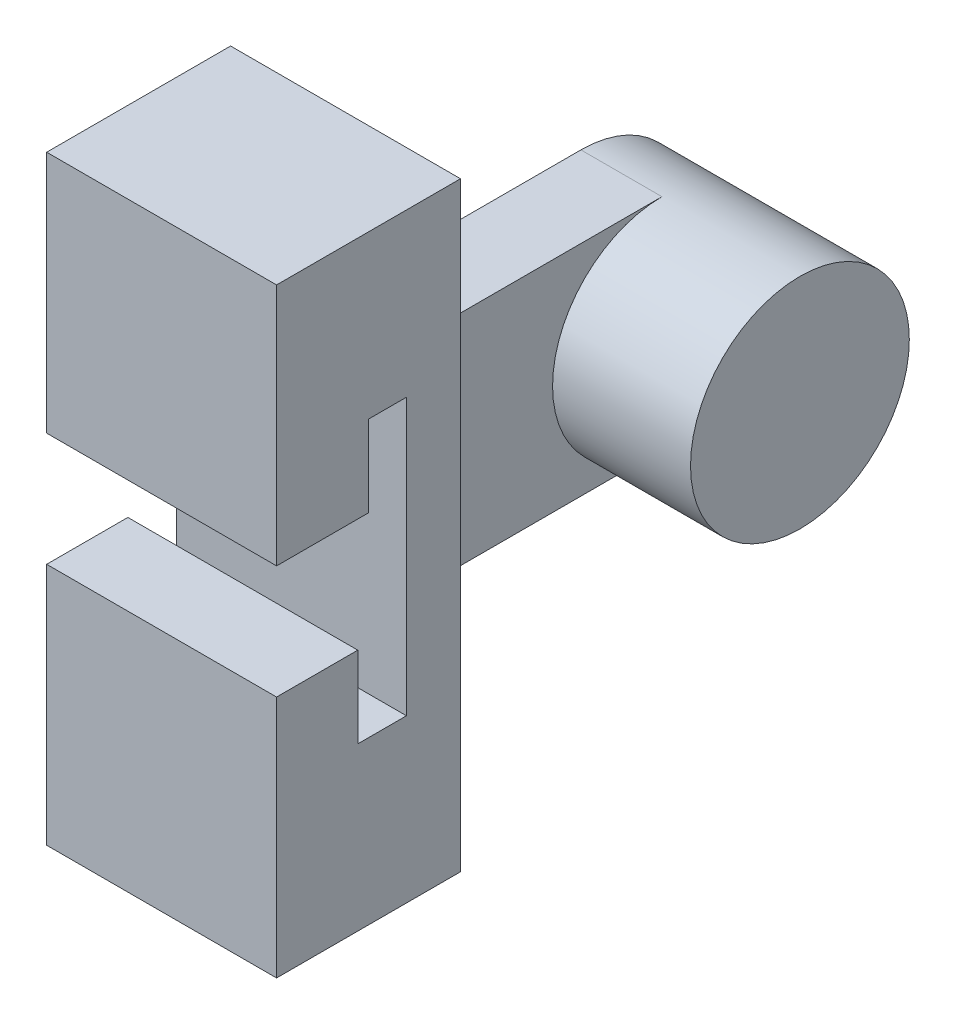
ISO-10303-21;
HEADER;
FILE_DESCRIPTION(('STEP AP214'),'2;1');
FILE_NAME('part.step','',(''),(''),'','','');
FILE_SCHEMA(('AUTOMOTIVE_DESIGN { 1 0 10303 214 1 1 1 1 }'));
ENDSEC;
DATA;
#1=APPLICATION_CONTEXT('core data for automotive mechanical design processes');
#2=APPLICATION_PROTOCOL_DEFINITION('international standard','automotive_design',2000,#1);
#3=PRODUCT_CONTEXT('',#1,'mechanical');
#4=PRODUCT('Part','Part','',(#3));
#5=PRODUCT_RELATED_PRODUCT_CATEGORY('part','',(#4));
#6=PRODUCT_DEFINITION_FORMATION('','',#4);
#7=PRODUCT_DEFINITION_CONTEXT('part definition',#1,'design');
#8=PRODUCT_DEFINITION('design','',#6,#7);
#9=PRODUCT_DEFINITION_SHAPE('','',#8);
#10=(LENGTH_UNIT() NAMED_UNIT(*) SI_UNIT(.MILLI.,.METRE.));
#11=(NAMED_UNIT(*) PLANE_ANGLE_UNIT() SI_UNIT($,.RADIAN.));
#12=(NAMED_UNIT(*) SI_UNIT($,.STERADIAN.) SOLID_ANGLE_UNIT());
#13=UNCERTAINTY_MEASURE_WITH_UNIT(LENGTH_MEASURE(1.E-05),#10,'distance_accuracy_value','');
#14=(GEOMETRIC_REPRESENTATION_CONTEXT(3) GLOBAL_UNCERTAINTY_ASSIGNED_CONTEXT((#13)) GLOBAL_UNIT_ASSIGNED_CONTEXT((#10,
#11,#12)) REPRESENTATION_CONTEXT('',''));
#15=CARTESIAN_POINT('',(0.,0.,0.));
#16=DIRECTION('',(0.,0.,1.));
#17=DIRECTION('',(1.,0.,0.));
#18=AXIS2_PLACEMENT_3D('',#15,#16,#17);
#19=CARTESIAN_POINT('',(0.,-38.1,0.));
#20=DIRECTION('',(0.,-1.,0.));
#21=DIRECTION('',(-1.,0.,0.));
#22=AXIS2_PLACEMENT_3D('',#19,#20,#21);
#23=PLANE('',#22);
#24=DIRECTION('',(-1.,0.,0.));
#25=VECTOR('',#24,1.);
#26=CARTESIAN_POINT('',(20.5526630882065,-38.1,104.57434));
#27=LINE('',#26,#25);
#28=CARTESIAN_POINT('',(20.5526630882065,-38.1,104.57434));
#29=VERTEX_POINT('',#28);
#30=CARTESIAN_POINT('',(-42.9473369117935,-38.1,104.57434));
#31=VERTEX_POINT('',#30);
#32=EDGE_CURVE('E77',#29,#31,#27,.T.);
#33=ORIENTED_EDGE('',*,*,#32,.F.);
#34=DIRECTION('',(0.,0.,-1.));
#35=VECTOR('',#34,1.);
#36=CARTESIAN_POINT('',(20.5526630882065,-38.1,127.));
#37=LINE('',#36,#35);
#38=CARTESIAN_POINT('',(20.5526630882065,-38.1,91.1297825490581));
#39=VERTEX_POINT('',#38);
#40=EDGE_CURVE('E197',#29,#39,#37,.T.);
#41=ORIENTED_EDGE('',*,*,#40,.T.);
#42=DIRECTION('',(1.,0.,0.));
#43=VECTOR('',#42,1.);
#44=CARTESIAN_POINT('',(-42.9473369117935,-38.1,91.1297825490581));
#45=LINE('',#44,#43);
#46=CARTESIAN_POINT('',(-42.9473369117935,-38.1,91.1297825490581));
#47=VERTEX_POINT('',#46);
#48=EDGE_CURVE('E294',#47,#39,#45,.T.);
#49=ORIENTED_EDGE('',*,*,#48,.F.);
#50=DIRECTION('',(0.,0.,1.));
#51=VECTOR('',#50,1.);
#52=CARTESIAN_POINT('',(-42.9473369117935,-38.1,76.2));
#53=LINE('',#52,#51);
#54=EDGE_CURVE('E82',#47,#31,#53,.T.);
#55=ORIENTED_EDGE('',*,*,#54,.T.);
#56=EDGE_LOOP('',(#33,#41,#49,#55));
#57=FACE_BOUND('',#56,.T.);
#58=ADVANCED_FACE('F61',(#57),#23,.F.);
#59=CARTESIAN_POINT('',(0.,38.1,0.));
#60=DIRECTION('',(0.,1.,0.));
#61=DIRECTION('',(-1.,0.,0.));
#62=AXIS2_PLACEMENT_3D('',#59,#60,#61);
#63=PLANE('',#62);
#64=DIRECTION('',(1.,0.,0.));
#65=VECTOR('',#64,1.);
#66=CARTESIAN_POINT('',(20.5526630882065,38.1,101.6));
#67=LINE('',#66,#65);
#68=CARTESIAN_POINT('',(-42.9473369117935,38.1,101.6));
#69=VERTEX_POINT('',#68);
#70=CARTESIAN_POINT('',(20.5526630882065,38.1,101.6));
#71=VERTEX_POINT('',#70);
#72=EDGE_CURVE('E199',#69,#71,#67,.T.);
#73=ORIENTED_EDGE('',*,*,#72,.F.);
#74=DIRECTION('',(0.,0.,1.));
#75=VECTOR('',#74,1.);
#76=CARTESIAN_POINT('',(-42.9473369117935,38.1,76.2));
#77=LINE('',#76,#75);
#78=CARTESIAN_POINT('',(-42.9473369117935,38.1,91.1297825490581));
#79=VERTEX_POINT('',#78);
#80=EDGE_CURVE('E263',#79,#69,#77,.T.);
#81=ORIENTED_EDGE('',*,*,#80,.F.);
#82=DIRECTION('',(-1.,0.,0.));
#83=VECTOR('',#82,1.);
#84=CARTESIAN_POINT('',(20.5526630882065,38.1,91.1297825490581));
#85=LINE('',#84,#83);
#86=CARTESIAN_POINT('',(20.5526630882065,38.1,91.1297825490581));
#87=VERTEX_POINT('',#86);
#88=EDGE_CURVE('E285',#87,#79,#85,.T.);
#89=ORIENTED_EDGE('',*,*,#88,.F.);
#90=DIRECTION('',(0.,0.,-1.));
#91=VECTOR('',#90,1.);
#92=CARTESIAN_POINT('',(20.5526630882065,38.1,127.));
#93=LINE('',#92,#91);
#94=EDGE_CURVE('E257',#71,#87,#93,.T.);
#95=ORIENTED_EDGE('',*,*,#94,.F.);
#96=EDGE_LOOP('',(#73,#81,#89,#95));
#97=FACE_BOUND('',#96,.T.);
#98=ADVANCED_FACE('F381',(#97),#63,.F.);
#99=CARTESIAN_POINT('',(38.1,0.,0.));
#100=DIRECTION('',(-1.,0.,0.));
#101=DIRECTION('',(0.,0.,1.));
#102=AXIS2_PLACEMENT_3D('',#99,#100,#101);
#103=CYLINDRICAL_SURFACE('',#102,30.2183804100461);
#104=CARTESIAN_POINT('',(38.1,0.,0.));
#105=DIRECTION('',(1.,0.,0.));
#106=DIRECTION('',(0.,0.,-1.));
#107=AXIS2_PLACEMENT_3D('',#104,#105,#106);
#108=CIRCLE('',#107,30.2183804100461);
#109=CARTESIAN_POINT('',(38.1,0.,-30.2183804100461));
#110=VERTEX_POINT('',#109);
#111=EDGE_CURVE('E13',#110,#110,#108,.T.);
#112=ORIENTED_EDGE('',*,*,#111,.F.);
#113=EDGE_LOOP('',(#112));
#114=FACE_BOUND('',#113,.T.);
#115=CARTESIAN_POINT('',(0.,0.,0.));
#116=DIRECTION('',(1.,0.,0.));
#117=DIRECTION('',(0.,0.,-1.));
#118=AXIS2_PLACEMENT_3D('',#115,#116,#117);
#119=CIRCLE('',#118,30.2183804100461);
#120=CARTESIAN_POINT('',(0.,30.2183804100461,0.));
#121=VERTEX_POINT('',#120);
#122=CARTESIAN_POINT('',(0.,-30.2183804100461,0.));
#123=VERTEX_POINT('',#122);
#124=EDGE_CURVE('E65',#121,#123,#119,.T.);
#125=ORIENTED_EDGE('',*,*,#124,.T.);
#126=DIRECTION('',(1.,0.,0.));
#127=VECTOR('',#126,1.);
#128=CARTESIAN_POINT('',(-22.3946738235871,-30.2183804100461,0.));
#129=LINE('',#128,#127);
#130=CARTESIAN_POINT('',(-22.3946738235871,-30.2183804100461,0.));
#131=VERTEX_POINT('',#130);
#132=EDGE_CURVE('E341',#131,#123,#129,.T.);
#133=ORIENTED_EDGE('',*,*,#132,.F.);
#134=CARTESIAN_POINT('',(-22.3946738235871,0.,0.));
#135=DIRECTION('',(-1.,0.,0.));
#136=DIRECTION('',(0.,0.,1.));
#137=AXIS2_PLACEMENT_3D('',#134,#135,#136);
#138=CIRCLE('',#137,30.2183804100461);
#139=CARTESIAN_POINT('',(-22.3946738235871,30.2183804100461,0.));
#140=VERTEX_POINT('',#139);
#141=EDGE_CURVE('E307',#140,#131,#138,.T.);
#142=ORIENTED_EDGE('',*,*,#141,.F.);
#143=DIRECTION('',(1.,0.,0.));
#144=VECTOR('',#143,1.);
#145=CARTESIAN_POINT('',(-22.3946738235871,30.2183804100461,0.));
#146=LINE('',#145,#144);
#147=EDGE_CURVE('E321',#140,#121,#146,.T.);
#148=ORIENTED_EDGE('',*,*,#147,.T.);
#149=EDGE_LOOP('',(#125,#133,#142,#148));
#150=FACE_BOUND('',#149,.T.);
#151=ADVANCED_FACE('F63',(#114,#150),#103,.T.);
#152=CARTESIAN_POINT('',(38.1,0.,0.));
#153=DIRECTION('',(1.,0.,0.));
#154=DIRECTION('',(0.,0.,-1.));
#155=AXIS2_PLACEMENT_3D('',#152,#153,#154);
#156=PLANE('',#155);
#157=ORIENTED_EDGE('',*,*,#111,.T.);
#158=EDGE_LOOP('',(#157));
#159=FACE_BOUND('',#158,.T.);
#160=ADVANCED_FACE('F377',(#159),#156,.T.);
#161=CARTESIAN_POINT('',(-22.3946738235871,-30.2183804100461,76.2));
#162=DIRECTION('',(0.,1.,0.));
#163=DIRECTION('',(0.,0.,1.));
#164=AXIS2_PLACEMENT_3D('',#161,#162,#163);
#165=PLANE('',#164);
#166=DIRECTION('',(0.,0.,1.));
#167=VECTOR('',#166,1.);
#168=CARTESIAN_POINT('',(0.,-30.2183804100461,76.2));
#169=LINE('',#168,#167);
#170=CARTESIAN_POINT('',(0.,-30.2183804100461,76.2));
#171=VERTEX_POINT('',#170);
#172=EDGE_CURVE('E302',#123,#171,#169,.T.);
#173=ORIENTED_EDGE('',*,*,#172,.T.);
#174=DIRECTION('',(1.,0.,0.));
#175=VECTOR('',#174,1.);
#176=CARTESIAN_POINT('',(-22.3946738235871,-30.2183804100461,76.2));
#177=LINE('',#176,#175);
#178=CARTESIAN_POINT('',(-22.3946738235871,-30.2183804100461,76.2));
#179=VERTEX_POINT('',#178);
#180=EDGE_CURVE('E337',#179,#171,#177,.T.);
#181=ORIENTED_EDGE('',*,*,#180,.F.);
#182=DIRECTION('',(0.,0.,1.));
#183=VECTOR('',#182,1.);
#184=CARTESIAN_POINT('',(-22.3946738235871,-30.2183804100461,76.2));
#185=LINE('',#184,#183);
#186=EDGE_CURVE('E311',#131,#179,#185,.T.);
#187=ORIENTED_EDGE('',*,*,#186,.F.);
#188=ORIENTED_EDGE('',*,*,#132,.T.);
#189=EDGE_LOOP('',(#173,#181,#187,#188));
#190=FACE_BOUND('',#189,.T.);
#191=ADVANCED_FACE('F360',(#190),#165,.F.);
#192=CARTESIAN_POINT('',(-22.3946738235871,30.2183804100461,0.));
#193=DIRECTION('',(0.,-1.,0.));
#194=DIRECTION('',(0.,0.,-1.));
#195=AXIS2_PLACEMENT_3D('',#192,#193,#194);
#196=PLANE('',#195);
#197=DIRECTION('',(0.,0.,-1.));
#198=VECTOR('',#197,1.);
#199=CARTESIAN_POINT('',(0.,30.2183804100461,0.));
#200=LINE('',#199,#198);
#201=CARTESIAN_POINT('',(0.,30.2183804100461,76.2));
#202=VERTEX_POINT('',#201);
#203=EDGE_CURVE('E312',#202,#121,#200,.T.);
#204=ORIENTED_EDGE('',*,*,#203,.T.);
#205=ORIENTED_EDGE('',*,*,#147,.F.);
#206=DIRECTION('',(0.,0.,-1.));
#207=VECTOR('',#206,1.);
#208=CARTESIAN_POINT('',(-22.3946738235871,30.2183804100461,0.));
#209=LINE('',#208,#207);
#210=CARTESIAN_POINT('',(-22.3946738235871,30.2183804100461,76.2));
#211=VERTEX_POINT('',#210);
#212=EDGE_CURVE('E318',#211,#140,#209,.T.);
#213=ORIENTED_EDGE('',*,*,#212,.F.);
#214=DIRECTION('',(1.,0.,0.));
#215=VECTOR('',#214,1.);
#216=CARTESIAN_POINT('',(-22.3946738235871,30.2183804100461,76.2));
#217=LINE('',#216,#215);
#218=EDGE_CURVE('E334',#211,#202,#217,.T.);
#219=ORIENTED_EDGE('',*,*,#218,.T.);
#220=EDGE_LOOP('',(#204,#205,#213,#219));
#221=FACE_BOUND('',#220,.T.);
#222=ADVANCED_FACE('F369',(#221),#196,.F.);
#223=CARTESIAN_POINT('',(-22.3946738235871,0.,0.));
#224=DIRECTION('',(-1.,0.,0.));
#225=DIRECTION('',(0.,0.,1.));
#226=AXIS2_PLACEMENT_3D('',#223,#224,#225);
#227=PLANE('',#226);
#228=ORIENTED_EDGE('',*,*,#141,.T.);
#229=ORIENTED_EDGE('',*,*,#186,.T.);
#230=DIRECTION('',(0.,1.,0.));
#231=VECTOR('',#230,1.);
#232=CARTESIAN_POINT('',(-22.3946738235871,30.2183804100461,76.2));
#233=LINE('',#232,#231);
#234=EDGE_CURVE('E315',#179,#211,#233,.T.);
#235=ORIENTED_EDGE('',*,*,#234,.T.);
#236=ORIENTED_EDGE('',*,*,#212,.T.);
#237=EDGE_LOOP('',(#228,#229,#235,#236));
#238=FACE_BOUND('',#237,.T.);
#239=ADVANCED_FACE('F367',(#238),#227,.T.);
#240=CARTESIAN_POINT('',(0.,0.,0.));
#241=DIRECTION('',(-1.,0.,0.));
#242=DIRECTION('',(0.,0.,1.));
#243=AXIS2_PLACEMENT_3D('',#240,#241,#242);
#244=PLANE('',#243);
#245=ORIENTED_EDGE('',*,*,#124,.F.);
#246=ORIENTED_EDGE('',*,*,#203,.F.);
#247=DIRECTION('',(0.,1.,0.));
#248=VECTOR('',#247,1.);
#249=CARTESIAN_POINT('',(0.,30.2183804100461,76.2));
#250=LINE('',#249,#248);
#251=EDGE_CURVE('E325',#171,#202,#250,.T.);
#252=ORIENTED_EDGE('',*,*,#251,.F.);
#253=ORIENTED_EDGE('',*,*,#172,.F.);
#254=EDGE_LOOP('',(#245,#246,#252,#253));
#255=FACE_BOUND('',#254,.T.);
#256=ADVANCED_FACE('F358',(#255),#244,.F.);
#257=CARTESIAN_POINT('',(0.,0.,76.2));
#258=DIRECTION('',(0.,0.,1.));
#259=DIRECTION('',(1.,0.,0.));
#260=AXIS2_PLACEMENT_3D('',#257,#258,#259);
#261=PLANE('',#260);
#262=DIRECTION('',(0.,-1.,0.));
#263=VECTOR('',#262,1.);
#264=CARTESIAN_POINT('',(-42.9473369117935,38.1,76.2));
#265=LINE('',#264,#263);
#266=CARTESIAN_POINT('',(-42.9473369117935,82.8893476471741,76.2));
#267=VERTEX_POINT('',#266);
#268=CARTESIAN_POINT('',(-42.9473369117935,-82.8893476471741,76.2));
#269=VERTEX_POINT('',#268);
#270=EDGE_CURVE('E284',#267,#269,#265,.T.);
#271=ORIENTED_EDGE('',*,*,#270,.F.);
#272=DIRECTION('',(-1.,0.,0.));
#273=VECTOR('',#272,1.);
#274=CARTESIAN_POINT('',(20.5526630882065,82.8893476471742,76.2));
#275=LINE('',#274,#273);
#276=CARTESIAN_POINT('',(20.5526630882065,82.8893476471742,76.2));
#277=VERTEX_POINT('',#276);
#278=EDGE_CURVE('E262',#277,#267,#275,.T.);
#279=ORIENTED_EDGE('',*,*,#278,.F.);
#280=DIRECTION('',(0.,1.,0.));
#281=VECTOR('',#280,1.);
#282=CARTESIAN_POINT('',(20.5526630882065,-38.1,76.2));
#283=LINE('',#282,#281);
#284=CARTESIAN_POINT('',(20.5526630882065,-82.8893476471742,76.2));
#285=VERTEX_POINT('',#284);
#286=EDGE_CURVE('E290',#285,#277,#283,.T.);
#287=ORIENTED_EDGE('',*,*,#286,.F.);
#288=DIRECTION('',(-1.,0.,0.));
#289=VECTOR('',#288,1.);
#290=CARTESIAN_POINT('',(20.5526630882065,-82.8893476471742,76.2));
#291=LINE('',#290,#289);
#292=EDGE_CURVE('E243',#285,#269,#291,.T.);
#293=ORIENTED_EDGE('',*,*,#292,.T.);
#294=EDGE_LOOP('',(#271,#279,#287,#293));
#295=FACE_BOUND('',#294,.T.);
#296=ORIENTED_EDGE('',*,*,#180,.T.);
#297=ORIENTED_EDGE('',*,*,#251,.T.);
#298=ORIENTED_EDGE('',*,*,#218,.F.);
#299=ORIENTED_EDGE('',*,*,#234,.F.);
#300=EDGE_LOOP('',(#296,#297,#298,#299));
#301=FACE_BOUND('',#300,.T.);
#302=ADVANCED_FACE('F363',(#295,#301),#261,.F.);
#303=CARTESIAN_POINT('',(-42.9473369117935,38.1,91.1297825490581));
#304=DIRECTION('',(1.,0.,0.));
#305=DIRECTION('',(0.,1.,0.));
#306=AXIS2_PLACEMENT_3D('',#303,#304,#305);
#307=PLANE('',#306);
#308=ORIENTED_EDGE('',*,*,#270,.T.);
#309=DIRECTION('',(0.,0.,1.));
#310=VECTOR('',#309,1.);
#311=CARTESIAN_POINT('',(-42.9473369117935,-82.8893476471741,76.2));
#312=LINE('',#311,#310);
#313=CARTESIAN_POINT('',(-42.9473369117935,-82.8893476471741,127.));
#314=VERTEX_POINT('',#313);
#315=EDGE_CURVE('E239',#269,#314,#312,.T.);
#316=ORIENTED_EDGE('',*,*,#315,.T.);
#317=DIRECTION('',(0.,1.,0.));
#318=VECTOR('',#317,1.);
#319=CARTESIAN_POINT('',(-42.9473369117935,-82.8893476471741,127.));
#320=LINE('',#319,#318);
#321=CARTESIAN_POINT('',(-42.9473369117935,-15.68196,127.));
#322=VERTEX_POINT('',#321);
#323=EDGE_CURVE('E247',#314,#322,#320,.T.);
#324=ORIENTED_EDGE('',*,*,#323,.T.);
#325=DIRECTION('',(0.,0.,1.));
#326=VECTOR('',#325,1.);
#327=CARTESIAN_POINT('',(-42.9473369117935,-15.68196,127.));
#328=LINE('',#327,#326);
#329=CARTESIAN_POINT('',(-42.9473369117935,-15.68196,104.57434));
#330=VERTEX_POINT('',#329);
#331=EDGE_CURVE('E184',#330,#322,#328,.T.);
#332=ORIENTED_EDGE('',*,*,#331,.F.);
#333=DIRECTION('',(0.,-1.,0.));
#334=VECTOR('',#333,1.);
#335=CARTESIAN_POINT('',(-42.9473369117935,-15.68196,104.57434));
#336=LINE('',#335,#334);
#337=EDGE_CURVE('E179',#330,#31,#336,.T.);
#338=ORIENTED_EDGE('',*,*,#337,.T.);
#339=ORIENTED_EDGE('',*,*,#54,.F.);
#340=DIRECTION('',(0.,-1.,0.));
#341=VECTOR('',#340,1.);
#342=CARTESIAN_POINT('',(-42.9473369117935,38.1,91.1297825490581));
#343=LINE('',#342,#341);
#344=EDGE_CURVE('E289',#79,#47,#343,.T.);
#345=ORIENTED_EDGE('',*,*,#344,.F.);
#346=ORIENTED_EDGE('',*,*,#80,.T.);
#347=DIRECTION('',(0.,1.,0.));
#348=VECTOR('',#347,1.);
#349=CARTESIAN_POINT('',(-42.9473369117935,15.68196,101.6));
#350=LINE('',#349,#348);
#351=CARTESIAN_POINT('',(-42.9473369117935,15.68196,101.6));
#352=VERTEX_POINT('',#351);
#353=EDGE_CURVE('E228',#352,#69,#350,.T.);
#354=ORIENTED_EDGE('',*,*,#353,.F.);
#355=DIRECTION('',(0.,0.,-1.));
#356=VECTOR('',#355,1.);
#357=CARTESIAN_POINT('',(-42.9473369117935,15.68196,101.6));
#358=LINE('',#357,#356);
#359=CARTESIAN_POINT('',(-42.9473369117935,15.68196,127.));
#360=VERTEX_POINT('',#359);
#361=EDGE_CURVE('E205',#360,#352,#358,.T.);
#362=ORIENTED_EDGE('',*,*,#361,.F.);
#363=DIRECTION('',(0.,-1.,0.));
#364=VECTOR('',#363,1.);
#365=CARTESIAN_POINT('',(-42.9473369117935,82.8893476471741,127.));
#366=LINE('',#365,#364);
#367=CARTESIAN_POINT('',(-42.9473369117935,82.8893476471741,127.));
#368=VERTEX_POINT('',#367);
#369=EDGE_CURVE('E281',#368,#360,#366,.T.);
#370=ORIENTED_EDGE('',*,*,#369,.F.);
#371=DIRECTION('',(0.,0.,1.));
#372=VECTOR('',#371,1.);
#373=CARTESIAN_POINT('',(-42.9473369117935,82.8893476471741,76.2));
#374=LINE('',#373,#372);
#375=EDGE_CURVE('E267',#267,#368,#374,.T.);
#376=ORIENTED_EDGE('',*,*,#375,.F.);
#377=EDGE_LOOP('',(#308,#316,#324,#332,#338,#339,#345,#346,#354,#362,#370,#376));
#378=FACE_BOUND('',#377,.T.);
#379=ADVANCED_FACE('F412',(#378),#307,.F.);
#380=CARTESIAN_POINT('',(20.5526630882065,-38.1,91.1297825490581));
#381=DIRECTION('',(-1.,0.,0.));
#382=DIRECTION('',(0.,0.,1.));
#383=AXIS2_PLACEMENT_3D('',#380,#381,#382);
#384=PLANE('',#383);
#385=ORIENTED_EDGE('',*,*,#286,.T.);
#386=DIRECTION('',(0.,0.,-1.));
#387=VECTOR('',#386,1.);
#388=CARTESIAN_POINT('',(20.5526630882065,82.8893476471742,127.));
#389=LINE('',#388,#387);
#390=CARTESIAN_POINT('',(20.5526630882065,82.8893476471742,127.));
#391=VERTEX_POINT('',#390);
#392=EDGE_CURVE('E258',#391,#277,#389,.T.);
#393=ORIENTED_EDGE('',*,*,#392,.F.);
#394=DIRECTION('',(0.,-1.,0.));
#395=VECTOR('',#394,1.);
#396=CARTESIAN_POINT('',(20.5526630882065,82.8893476471742,127.));
#397=LINE('',#396,#395);
#398=CARTESIAN_POINT('',(20.5526630882065,15.68196,127.));
#399=VERTEX_POINT('',#398);
#400=EDGE_CURVE('E273',#391,#399,#397,.T.);
#401=ORIENTED_EDGE('',*,*,#400,.T.);
#402=DIRECTION('',(0.,0.,1.));
#403=VECTOR('',#402,1.);
#404=CARTESIAN_POINT('',(20.5526630882065,15.68196,127.));
#405=LINE('',#404,#403);
#406=CARTESIAN_POINT('',(20.5526630882065,15.68196,101.6));
#407=VERTEX_POINT('',#406);
#408=EDGE_CURVE('E216',#407,#399,#405,.T.);
#409=ORIENTED_EDGE('',*,*,#408,.F.);
#410=DIRECTION('',(0.,1.,0.));
#411=VECTOR('',#410,1.);
#412=CARTESIAN_POINT('',(20.5526630882065,15.68196,101.6));
#413=LINE('',#412,#411);
#414=EDGE_CURVE('E223',#407,#71,#413,.T.);
#415=ORIENTED_EDGE('',*,*,#414,.T.);
#416=ORIENTED_EDGE('',*,*,#94,.T.);
#417=DIRECTION('',(0.,1.,0.));
#418=VECTOR('',#417,1.);
#419=CARTESIAN_POINT('',(20.5526630882065,-38.1,91.1297825490581));
#420=LINE('',#419,#418);
#421=EDGE_CURVE('E298',#39,#87,#420,.T.);
#422=ORIENTED_EDGE('',*,*,#421,.F.);
#423=ORIENTED_EDGE('',*,*,#40,.F.);
#424=DIRECTION('',(0.,-1.,0.));
#425=VECTOR('',#424,1.);
#426=CARTESIAN_POINT('',(20.5526630882065,-15.68196,104.57434));
#427=LINE('',#426,#425);
#428=CARTESIAN_POINT('',(20.5526630882065,-15.68196,104.57434));
#429=VERTEX_POINT('',#428);
#430=EDGE_CURVE('E177',#429,#29,#427,.T.);
#431=ORIENTED_EDGE('',*,*,#430,.F.);
#432=DIRECTION('',(0.,0.,-1.));
#433=VECTOR('',#432,1.);
#434=CARTESIAN_POINT('',(20.5526630882065,-15.68196,127.));
#435=LINE('',#434,#433);
#436=CARTESIAN_POINT('',(20.5526630882065,-15.68196,127.));
#437=VERTEX_POINT('',#436);
#438=EDGE_CURVE('E185',#437,#429,#435,.T.);
#439=ORIENTED_EDGE('',*,*,#438,.F.);
#440=DIRECTION('',(0.,1.,0.));
#441=VECTOR('',#440,1.);
#442=CARTESIAN_POINT('',(20.5526630882065,-82.8893476471742,127.));
#443=LINE('',#442,#441);
#444=CARTESIAN_POINT('',(20.5526630882065,-82.8893476471742,127.));
#445=VERTEX_POINT('',#444);
#446=EDGE_CURVE('E254',#445,#437,#443,.T.);
#447=ORIENTED_EDGE('',*,*,#446,.F.);
#448=DIRECTION('',(0.,0.,-1.));
#449=VECTOR('',#448,1.);
#450=CARTESIAN_POINT('',(20.5526630882065,-82.8893476471742,127.));
#451=LINE('',#450,#449);
#452=EDGE_CURVE('E231',#445,#285,#451,.T.);
#453=ORIENTED_EDGE('',*,*,#452,.T.);
#454=EDGE_LOOP('',(#385,#393,#401,#409,#415,#416,#422,#423,#431,#439,#447,#453));
#455=FACE_BOUND('',#454,.T.);
#456=ADVANCED_FACE('F195',(#455),#384,.F.);
#457=CARTESIAN_POINT('',(0.,0.,91.1297825490581));
#458=DIRECTION('',(0.,0.,1.));
#459=DIRECTION('',(1.,0.,0.));
#460=AXIS2_PLACEMENT_3D('',#457,#458,#459);
#461=PLANE('',#460);
#462=ORIENTED_EDGE('',*,*,#88,.T.);
#463=ORIENTED_EDGE('',*,*,#344,.T.);
#464=ORIENTED_EDGE('',*,*,#48,.T.);
#465=ORIENTED_EDGE('',*,*,#421,.T.);
#466=EDGE_LOOP('',(#462,#463,#464,#465));
#467=FACE_BOUND('',#466,.T.);
#468=ADVANCED_FACE('F405',(#467),#461,.T.);
#469=CARTESIAN_POINT('',(-42.9473369117935,82.8893476471741,127.));
#470=DIRECTION('',(0.,0.,-1.));
#471=DIRECTION('',(-1.,0.,0.));
#472=AXIS2_PLACEMENT_3D('',#469,#470,#471);
#473=PLANE('',#472);
#474=ORIENTED_EDGE('',*,*,#369,.T.);
#475=DIRECTION('',(-1.,0.,0.));
#476=VECTOR('',#475,1.);
#477=CARTESIAN_POINT('',(-42.9473369117935,15.68196,127.));
#478=LINE('',#477,#476);
#479=EDGE_CURVE('E220',#399,#360,#478,.T.);
#480=ORIENTED_EDGE('',*,*,#479,.F.);
#481=ORIENTED_EDGE('',*,*,#400,.F.);
#482=DIRECTION('',(1.,0.,0.));
#483=VECTOR('',#482,1.);
#484=CARTESIAN_POINT('',(-42.9473369117935,82.8893476471741,127.));
#485=LINE('',#484,#483);
#486=EDGE_CURVE('E270',#368,#391,#485,.T.);
#487=ORIENTED_EDGE('',*,*,#486,.F.);
#488=EDGE_LOOP('',(#474,#480,#481,#487));
#489=FACE_BOUND('',#488,.T.);
#490=ADVANCED_FACE('F400',(#489),#473,.F.);
#491=CARTESIAN_POINT('',(0.,82.8893476471742,0.));
#492=DIRECTION('',(0.,1.,0.));
#493=DIRECTION('',(-1.,0.,0.));
#494=AXIS2_PLACEMENT_3D('',#491,#492,#493);
#495=PLANE('',#494);
#496=ORIENTED_EDGE('',*,*,#392,.T.);
#497=ORIENTED_EDGE('',*,*,#278,.T.);
#498=ORIENTED_EDGE('',*,*,#375,.T.);
#499=ORIENTED_EDGE('',*,*,#486,.T.);
#500=EDGE_LOOP('',(#496,#497,#498,#499));
#501=FACE_BOUND('',#500,.T.);
#502=ADVANCED_FACE('F397',(#501),#495,.T.);
#503=CARTESIAN_POINT('',(-42.9473369117935,-82.8893476471741,127.));
#504=DIRECTION('',(0.,0.,1.));
#505=DIRECTION('',(1.,0.,0.));
#506=AXIS2_PLACEMENT_3D('',#503,#504,#505);
#507=PLANE('',#506);
#508=ORIENTED_EDGE('',*,*,#446,.T.);
#509=DIRECTION('',(1.,0.,0.));
#510=VECTOR('',#509,1.);
#511=CARTESIAN_POINT('',(20.5526630882065,-15.68196,127.));
#512=LINE('',#511,#510);
#513=EDGE_CURVE('E191',#322,#437,#512,.T.);
#514=ORIENTED_EDGE('',*,*,#513,.F.);
#515=ORIENTED_EDGE('',*,*,#323,.F.);
#516=DIRECTION('',(1.,0.,0.));
#517=VECTOR('',#516,1.);
#518=CARTESIAN_POINT('',(-42.9473369117935,-82.8893476471741,127.));
#519=LINE('',#518,#517);
#520=EDGE_CURVE('E235',#314,#445,#519,.T.);
#521=ORIENTED_EDGE('',*,*,#520,.T.);
#522=EDGE_LOOP('',(#508,#514,#515,#521));
#523=FACE_BOUND('',#522,.T.);
#524=ADVANCED_FACE('F394',(#523),#507,.T.);
#525=CARTESIAN_POINT('',(0.,-82.8893476471742,0.));
#526=DIRECTION('',(0.,-1.,0.));
#527=DIRECTION('',(-1.,0.,0.));
#528=AXIS2_PLACEMENT_3D('',#525,#526,#527);
#529=PLANE('',#528);
#530=ORIENTED_EDGE('',*,*,#452,.F.);
#531=ORIENTED_EDGE('',*,*,#520,.F.);
#532=ORIENTED_EDGE('',*,*,#315,.F.);
#533=ORIENTED_EDGE('',*,*,#292,.F.);
#534=EDGE_LOOP('',(#530,#531,#532,#533));
#535=FACE_BOUND('',#534,.T.);
#536=ADVANCED_FACE('F392',(#535),#529,.T.);
#537=CARTESIAN_POINT('',(20.5526630882065,15.68196,101.6));
#538=DIRECTION('',(0.,0.,1.));
#539=DIRECTION('',(0.,-1.,0.));
#540=AXIS2_PLACEMENT_3D('',#537,#538,#539);
#541=PLANE('',#540);
#542=ORIENTED_EDGE('',*,*,#72,.T.);
#543=ORIENTED_EDGE('',*,*,#414,.F.);
#544=DIRECTION('',(1.,0.,0.));
#545=VECTOR('',#544,1.);
#546=CARTESIAN_POINT('',(20.5526630882065,15.68196,101.6));
#547=LINE('',#546,#545);
#548=EDGE_CURVE('E213',#352,#407,#547,.T.);
#549=ORIENTED_EDGE('',*,*,#548,.F.);
#550=ORIENTED_EDGE('',*,*,#353,.T.);
#551=EDGE_LOOP('',(#542,#543,#549,#550));
#552=FACE_BOUND('',#551,.T.);
#553=ADVANCED_FACE('F447',(#552),#541,.F.);
#554=CARTESIAN_POINT('',(0.,15.68196,0.));
#555=DIRECTION('',(0.,1.,0.));
#556=DIRECTION('',(-1.,0.,0.));
#557=AXIS2_PLACEMENT_3D('',#554,#555,#556);
#558=PLANE('',#557);
#559=ORIENTED_EDGE('',*,*,#361,.T.);
#560=ORIENTED_EDGE('',*,*,#548,.T.);
#561=ORIENTED_EDGE('',*,*,#408,.T.);
#562=ORIENTED_EDGE('',*,*,#479,.T.);
#563=EDGE_LOOP('',(#559,#560,#561,#562));
#564=FACE_BOUND('',#563,.T.);
#565=ADVANCED_FACE('F466',(#564),#558,.F.);
#566=CARTESIAN_POINT('',(20.5526630882065,-15.68196,104.57434));
#567=DIRECTION('',(0.,0.,1.));
#568=DIRECTION('',(0.,-1.,0.));
#569=AXIS2_PLACEMENT_3D('',#566,#567,#568);
#570=PLANE('',#569);
#571=ORIENTED_EDGE('',*,*,#32,.T.);
#572=ORIENTED_EDGE('',*,*,#337,.F.);
#573=DIRECTION('',(-1.,0.,0.));
#574=VECTOR('',#573,1.);
#575=CARTESIAN_POINT('',(20.5526630882065,-15.68196,104.57434));
#576=LINE('',#575,#574);
#577=EDGE_CURVE('E173',#429,#330,#576,.T.);
#578=ORIENTED_EDGE('',*,*,#577,.F.);
#579=ORIENTED_EDGE('',*,*,#430,.T.);
#580=EDGE_LOOP('',(#571,#572,#578,#579));
#581=FACE_BOUND('',#580,.T.);
#582=ADVANCED_FACE('F175',(#581),#570,.F.);
#583=CARTESIAN_POINT('',(0.,-15.68196,0.));
#584=DIRECTION('',(0.,1.,0.));
#585=DIRECTION('',(-1.,0.,0.));
#586=AXIS2_PLACEMENT_3D('',#583,#584,#585);
#587=PLANE('',#586);
#588=ORIENTED_EDGE('',*,*,#438,.T.);
#589=ORIENTED_EDGE('',*,*,#577,.T.);
#590=ORIENTED_EDGE('',*,*,#331,.T.);
#591=ORIENTED_EDGE('',*,*,#513,.T.);
#592=EDGE_LOOP('',(#588,#589,#590,#591));
#593=FACE_BOUND('',#592,.T.);
#594=ADVANCED_FACE('F189',(#593),#587,.T.);
#595=CLOSED_SHELL('',(#58,#98,#151,#160,#191,#222,#239,#256,#302,#379,#456,#468,#490,#502,#524,
#536,#553,#565,#582,#594));
#596=MANIFOLD_SOLID_BREP('B2',#595);
#597=ADVANCED_BREP_SHAPE_REPRESENTATION('',(#18,#596),#14);
#598=SHAPE_DEFINITION_REPRESENTATION(#9,#597);
ENDSEC;
END-ISO-10303-21;
